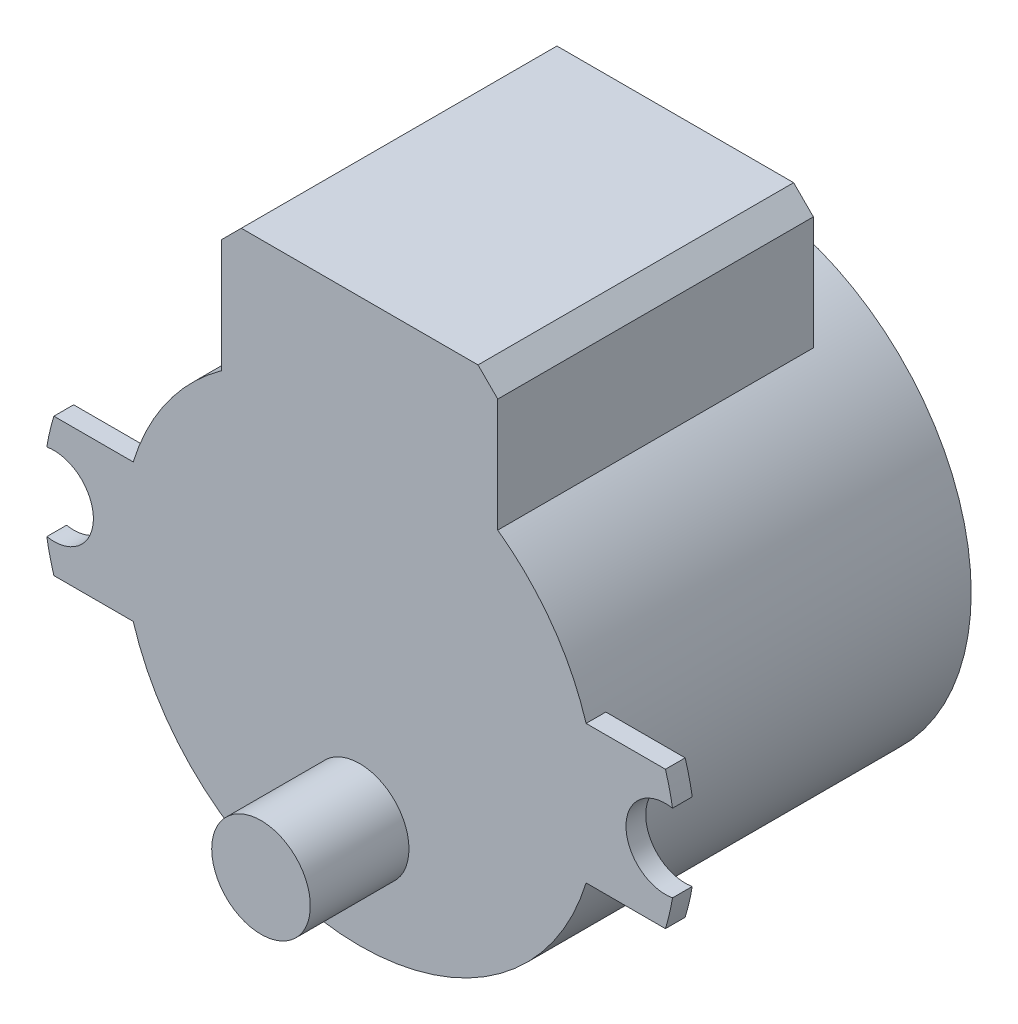
ISO-10303-21;
HEADER;
FILE_DESCRIPTION(('STEP AP214'),'2;1');
FILE_NAME('part.step','',(''),(''),'','','');
FILE_SCHEMA(('AUTOMOTIVE_DESIGN { 1 0 10303 214 1 1 1 1 }'));
ENDSEC;
DATA;
#1=APPLICATION_CONTEXT('core data for automotive mechanical design processes');
#2=APPLICATION_PROTOCOL_DEFINITION('international standard','automotive_design',2000,#1);
#3=PRODUCT_CONTEXT('',#1,'mechanical');
#4=PRODUCT('Part','Part','',(#3));
#5=PRODUCT_RELATED_PRODUCT_CATEGORY('part','',(#4));
#6=PRODUCT_DEFINITION_FORMATION('','',#4);
#7=PRODUCT_DEFINITION_CONTEXT('part definition',#1,'design');
#8=PRODUCT_DEFINITION('design','',#6,#7);
#9=PRODUCT_DEFINITION_SHAPE('','',#8);
#10=(LENGTH_UNIT() NAMED_UNIT(*) SI_UNIT(.MILLI.,.METRE.));
#11=(NAMED_UNIT(*) PLANE_ANGLE_UNIT() SI_UNIT($,.RADIAN.));
#12=(NAMED_UNIT(*) SI_UNIT($,.STERADIAN.) SOLID_ANGLE_UNIT());
#13=UNCERTAINTY_MEASURE_WITH_UNIT(LENGTH_MEASURE(1.E-05),#10,'distance_accuracy_value','');
#14=(GEOMETRIC_REPRESENTATION_CONTEXT(3) GLOBAL_UNCERTAINTY_ASSIGNED_CONTEXT((#13)) GLOBAL_UNIT_ASSIGNED_CONTEXT((#10,
#11,#12)) REPRESENTATION_CONTEXT('',''));
#15=CARTESIAN_POINT('',(0.,0.,0.));
#16=DIRECTION('',(0.,0.,1.));
#17=DIRECTION('',(1.,0.,0.));
#18=AXIS2_PLACEMENT_3D('',#15,#16,#17);
#19=CARTESIAN_POINT('',(-4.021759716751,0.,1.));
#20=DIRECTION('',(0.,0.,-1.));
#21=DIRECTION('',(-1.,0.,0.));
#22=AXIS2_PLACEMENT_3D('',#19,#20,#21);
#23=CYLINDRICAL_SURFACE('',#22,12.);
#24=DIRECTION('',(0.,0.,1.));
#25=VECTOR('',#24,1.);
#26=CARTESIAN_POINT('',(-15.8593756445419,1.96744736806604,-8.5));
#27=LINE('',#26,#25);
#28=CARTESIAN_POINT('',(-15.8593756445419,1.96744736806605,1.));
#29=VERTEX_POINT('',#28);
#30=CARTESIAN_POINT('',(-15.8593756445419,1.96744736806604,0.));
#31=VERTEX_POINT('',#30);
#32=EDGE_CURVE('E165',#29,#31,#27,.F.);
#33=ORIENTED_EDGE('',*,*,#32,.F.);
#34=CARTESIAN_POINT('',(-4.021759716751,0.,1.));
#35=DIRECTION('',(0.,0.,-1.));
#36=DIRECTION('',(-1.,0.,0.));
#37=AXIS2_PLACEMENT_3D('',#34,#35,#36);
#38=CIRCLE('',#37,12.);
#39=CARTESIAN_POINT('',(-15.5,3.5,1.));
#40=VERTEX_POINT('',#39);
#41=EDGE_CURVE('E177',#29,#40,#38,.T.);
#42=ORIENTED_EDGE('',*,*,#41,.T.);
#43=DIRECTION('',(0.,0.,-1.));
#44=VECTOR('',#43,1.);
#45=CARTESIAN_POINT('',(-15.5,3.5,1.));
#46=LINE('',#45,#44);
#47=CARTESIAN_POINT('',(-15.5,3.5,0.));
#48=VERTEX_POINT('',#47);
#49=EDGE_CURVE('E198',#40,#48,#46,.T.);
#50=ORIENTED_EDGE('',*,*,#49,.T.);
#51=CARTESIAN_POINT('',(-4.021759716751,0.,0.));
#52=DIRECTION('',(0.,0.,1.));
#53=DIRECTION('',(1.,0.,0.));
#54=AXIS2_PLACEMENT_3D('',#51,#52,#53);
#55=CIRCLE('',#54,12.);
#56=EDGE_CURVE('E180',#48,#31,#55,.T.);
#57=ORIENTED_EDGE('',*,*,#56,.T.);
#58=EDGE_LOOP('',(#33,#42,#50,#57));
#59=FACE_BOUND('',#58,.T.);
#60=ADVANCED_FACE('F35',(#59),#23,.T.);
#61=CARTESIAN_POINT('',(4.021759716751,0.,1.));
#62=DIRECTION('',(0.,0.,-1.));
#63=DIRECTION('',(-1.,0.,0.));
#64=AXIS2_PLACEMENT_3D('',#61,#62,#63);
#65=CYLINDRICAL_SURFACE('',#64,12.);
#66=DIRECTION('',(0.,0.,1.));
#67=VECTOR('',#66,1.);
#68=CARTESIAN_POINT('',(15.8593756445419,-1.96744736806604,-8.5));
#69=LINE('',#68,#67);
#70=CARTESIAN_POINT('',(15.8593756445419,-1.96744736806605,1.));
#71=VERTEX_POINT('',#70);
#72=CARTESIAN_POINT('',(15.8593756445419,-1.96744736806604,0.));
#73=VERTEX_POINT('',#72);
#74=EDGE_CURVE('E173',#71,#73,#69,.F.);
#75=ORIENTED_EDGE('',*,*,#74,.F.);
#76=CARTESIAN_POINT('',(4.021759716751,0.,1.));
#77=DIRECTION('',(0.,0.,-1.));
#78=DIRECTION('',(-1.,0.,0.));
#79=AXIS2_PLACEMENT_3D('',#76,#77,#78);
#80=CIRCLE('',#79,12.);
#81=CARTESIAN_POINT('',(15.5,-3.5,1.));
#82=VERTEX_POINT('',#81);
#83=EDGE_CURVE('E238',#71,#82,#80,.T.);
#84=ORIENTED_EDGE('',*,*,#83,.T.);
#85=DIRECTION('',(0.,0.,-1.));
#86=VECTOR('',#85,1.);
#87=CARTESIAN_POINT('',(15.5,-3.5,1.));
#88=LINE('',#87,#86);
#89=CARTESIAN_POINT('',(15.5,-3.5,0.));
#90=VERTEX_POINT('',#89);
#91=EDGE_CURVE('E226',#82,#90,#88,.T.);
#92=ORIENTED_EDGE('',*,*,#91,.T.);
#93=CARTESIAN_POINT('',(4.021759716751,0.,0.));
#94=DIRECTION('',(0.,0.,1.));
#95=DIRECTION('',(1.,0.,0.));
#96=AXIS2_PLACEMENT_3D('',#93,#94,#95);
#97=CIRCLE('',#96,12.);
#98=EDGE_CURVE('E221',#90,#73,#97,.T.);
#99=ORIENTED_EDGE('',*,*,#98,.T.);
#100=EDGE_LOOP('',(#75,#84,#92,#99));
#101=FACE_BOUND('',#100,.T.);
#102=ADVANCED_FACE('F322',(#101),#65,.T.);
#103=CARTESIAN_POINT('',(0.,0.,1.));
#104=DIRECTION('',(0.,0.,-1.));
#105=DIRECTION('',(-1.,0.,0.));
#106=AXIS2_PLACEMENT_3D('',#103,#104,#105);
#107=CYLINDRICAL_SURFACE('',#106,12.);
#108=DIRECTION('',(0.,0.,-1.));
#109=VECTOR('',#108,1.);
#110=CARTESIAN_POINT('',(-11.478240283249,3.5,1.));
#111=LINE('',#110,#109);
#112=CARTESIAN_POINT('',(-11.478240283249,3.5,1.));
#113=VERTEX_POINT('',#112);
#114=CARTESIAN_POINT('',(-11.478240283249,3.5,0.));
#115=VERTEX_POINT('',#114);
#116=EDGE_CURVE('E205',#113,#115,#111,.T.);
#117=ORIENTED_EDGE('',*,*,#116,.F.);
#118=CARTESIAN_POINT('',(0.,0.,1.));
#119=DIRECTION('',(0.,0.,-1.));
#120=DIRECTION('',(-1.,0.,0.));
#121=AXIS2_PLACEMENT_3D('',#118,#119,#120);
#122=CIRCLE('',#121,12.);
#123=CARTESIAN_POINT('',(-7.,9.74679434480896,1.));
#124=VERTEX_POINT('',#123);
#125=EDGE_CURVE('E271',#113,#124,#122,.T.);
#126=ORIENTED_EDGE('',*,*,#125,.T.);
#127=DIRECTION('',(0.,0.,-1.));
#128=VECTOR('',#127,1.);
#129=CARTESIAN_POINT('',(-7.,9.74679434480896,1.));
#130=LINE('',#129,#128);
#131=CARTESIAN_POINT('',(-7.,9.74679434480896,-15.));
#132=VERTEX_POINT('',#131);
#133=EDGE_CURVE('E258',#124,#132,#130,.T.);
#134=ORIENTED_EDGE('',*,*,#133,.T.);
#135=CARTESIAN_POINT('',(0.,0.,-15.));
#136=DIRECTION('',(0.,0.,-1.));
#137=DIRECTION('',(-1.,0.,0.));
#138=AXIS2_PLACEMENT_3D('',#135,#136,#137);
#139=CIRCLE('',#138,12.);
#140=CARTESIAN_POINT('',(7.,9.74679434480896,-15.));
#141=VERTEX_POINT('',#140);
#142=EDGE_CURVE('E215',#132,#141,#139,.T.);
#143=ORIENTED_EDGE('',*,*,#142,.T.);
#144=DIRECTION('',(0.,0.,-1.));
#145=VECTOR('',#144,1.);
#146=CARTESIAN_POINT('',(7.,9.74679434480896,1.));
#147=LINE('',#146,#145);
#148=CARTESIAN_POINT('',(7.,9.74679434480896,1.));
#149=VERTEX_POINT('',#148);
#150=EDGE_CURVE('E265',#141,#149,#147,.F.);
#151=ORIENTED_EDGE('',*,*,#150,.T.);
#152=CARTESIAN_POINT('',(11.478240283249,3.5,1.));
#153=VERTEX_POINT('',#152);
#154=EDGE_CURVE('E272',#149,#153,#122,.T.);
#155=ORIENTED_EDGE('',*,*,#154,.T.);
#156=DIRECTION('',(0.,0.,-1.));
#157=VECTOR('',#156,1.);
#158=CARTESIAN_POINT('',(11.478240283249,3.5,1.));
#159=LINE('',#158,#157);
#160=CARTESIAN_POINT('',(11.478240283249,3.5,0.));
#161=VERTEX_POINT('',#160);
#162=EDGE_CURVE('E213',#153,#161,#159,.T.);
#163=ORIENTED_EDGE('',*,*,#162,.T.);
#164=CARTESIAN_POINT('',(0.,0.,0.));
#165=DIRECTION('',(0.,0.,1.));
#166=DIRECTION('',(1.,0.,0.));
#167=AXIS2_PLACEMENT_3D('',#164,#165,#166);
#168=CIRCLE('',#167,12.);
#169=CARTESIAN_POINT('',(11.478240283249,-3.50000000000001,0.));
#170=VERTEX_POINT('',#169);
#171=EDGE_CURVE('E217',#170,#161,#168,.T.);
#172=ORIENTED_EDGE('',*,*,#171,.F.);
#173=DIRECTION('',(0.,0.,-1.));
#174=VECTOR('',#173,1.);
#175=CARTESIAN_POINT('',(11.478240283249,-3.5,1.));
#176=LINE('',#175,#174);
#177=CARTESIAN_POINT('',(11.478240283249,-3.5,1.));
#178=VERTEX_POINT('',#177);
#179=EDGE_CURVE('E222',#178,#170,#176,.T.);
#180=ORIENTED_EDGE('',*,*,#179,.F.);
#181=CARTESIAN_POINT('',(-11.478240283249,-3.5,1.));
#182=VERTEX_POINT('',#181);
#183=EDGE_CURVE('E275',#178,#182,#122,.T.);
#184=ORIENTED_EDGE('',*,*,#183,.T.);
#185=DIRECTION('',(0.,0.,-1.));
#186=VECTOR('',#185,1.);
#187=CARTESIAN_POINT('',(-11.478240283249,-3.5,1.));
#188=LINE('',#187,#186);
#189=CARTESIAN_POINT('',(-11.478240283249,-3.5,0.));
#190=VERTEX_POINT('',#189);
#191=EDGE_CURVE('E375',#182,#190,#188,.T.);
#192=ORIENTED_EDGE('',*,*,#191,.T.);
#193=CARTESIAN_POINT('',(0.,0.,0.));
#194=DIRECTION('',(0.,0.,1.));
#195=DIRECTION('',(1.,0.,0.));
#196=AXIS2_PLACEMENT_3D('',#193,#194,#195);
#197=CIRCLE('',#196,12.);
#198=EDGE_CURVE('E210',#115,#190,#197,.T.);
#199=ORIENTED_EDGE('',*,*,#198,.F.);
#200=EDGE_LOOP('',(#117,#126,#134,#143,#151,#155,#163,#172,#180,#184,#192,#199));
#201=FACE_BOUND('',#200,.T.);
#202=CARTESIAN_POINT('',(0.,0.,-18.));
#203=DIRECTION('',(0.,0.,-1.));
#204=DIRECTION('',(-1.,0.,0.));
#205=AXIS2_PLACEMENT_3D('',#202,#203,#204);
#206=CIRCLE('',#205,12.);
#207=CARTESIAN_POINT('',(-12.,0.,-18.));
#208=VERTEX_POINT('',#207);
#209=EDGE_CURVE('E254',#208,#208,#206,.T.);
#210=ORIENTED_EDGE('',*,*,#209,.F.);
#211=EDGE_LOOP('',(#210));
#212=FACE_BOUND('',#211,.T.);
#213=ADVANCED_FACE('F307',(#201,#212),#107,.T.);
#214=CARTESIAN_POINT('',(12.,0.,1.));
#215=DIRECTION('',(0.,0.,1.));
#216=DIRECTION('',(1.,0.,0.));
#217=AXIS2_PLACEMENT_3D('',#214,#215,#216);
#218=PLANE('',#217);
#219=DIRECTION('',(0.,1.,0.));
#220=VECTOR('',#219,1.);
#221=CARTESIAN_POINT('',(7.,-12.002,1.));
#222=LINE('',#221,#220);
#223=CARTESIAN_POINT('',(7.,15.5,1.));
#224=VERTEX_POINT('',#223);
#225=EDGE_CURVE('E257',#149,#224,#222,.T.);
#226=ORIENTED_EDGE('',*,*,#225,.T.);
#227=DIRECTION('',(0.707106781186547,-0.707106781186548,0.));
#228=VECTOR('',#227,1.);
#229=CARTESIAN_POINT('',(17.25,5.24999999999999,1.));
#230=LINE('',#229,#228);
#231=CARTESIAN_POINT('',(6.,16.5,1.));
#232=VERTEX_POINT('',#231);
#233=EDGE_CURVE('E44',#224,#232,#230,.F.);
#234=ORIENTED_EDGE('',*,*,#233,.T.);
#235=DIRECTION('',(1.,0.,0.));
#236=VECTOR('',#235,1.);
#237=CARTESIAN_POINT('',(-7.,16.5,1.));
#238=LINE('',#237,#236);
#239=CARTESIAN_POINT('',(-6.,16.5,1.));
#240=VERTEX_POINT('',#239);
#241=EDGE_CURVE('E250',#240,#232,#238,.T.);
#242=ORIENTED_EDGE('',*,*,#241,.F.);
#243=DIRECTION('',(0.707106781186548,0.707106781186548,0.));
#244=VECTOR('',#243,1.);
#245=CARTESIAN_POINT('',(-5.25,17.25,1.));
#246=LINE('',#245,#244);
#247=CARTESIAN_POINT('',(-7.,15.5,1.));
#248=VERTEX_POINT('',#247);
#249=EDGE_CURVE('E51',#240,#248,#246,.F.);
#250=ORIENTED_EDGE('',*,*,#249,.T.);
#251=DIRECTION('',(0.,1.,0.));
#252=VECTOR('',#251,1.);
#253=CARTESIAN_POINT('',(-7.,-12.002,1.));
#254=LINE('',#253,#252);
#255=EDGE_CURVE('E255',#124,#248,#254,.T.);
#256=ORIENTED_EDGE('',*,*,#255,.F.);
#257=ORIENTED_EDGE('',*,*,#125,.F.);
#258=DIRECTION('',(-1.,0.,0.));
#259=VECTOR('',#258,1.);
#260=CARTESIAN_POINT('',(-11.478240283249,3.5,1.));
#261=LINE('',#260,#259);
#262=EDGE_CURVE('E187',#113,#40,#261,.T.);
#263=ORIENTED_EDGE('',*,*,#262,.T.);
#264=ORIENTED_EDGE('',*,*,#41,.F.);
#265=CARTESIAN_POINT('',(-15.5,0.,1.));
#266=DIRECTION('',(0.,0.,1.));
#267=DIRECTION('',(1.,0.,0.));
#268=AXIS2_PLACEMENT_3D('',#265,#266,#267);
#269=CIRCLE('',#268,1.99999999999999);
#270=CARTESIAN_POINT('',(-15.8593756445419,-1.96744736806604,1.));
#271=VERTEX_POINT('',#270);
#272=EDGE_CURVE('E162',#271,#29,#269,.T.);
#273=ORIENTED_EDGE('',*,*,#272,.F.);
#274=CARTESIAN_POINT('',(-15.5,-3.5,1.));
#275=VERTEX_POINT('',#274);
#276=EDGE_CURVE('E189',#275,#271,#38,.T.);
#277=ORIENTED_EDGE('',*,*,#276,.F.);
#278=DIRECTION('',(-1.,0.,0.));
#279=VECTOR('',#278,1.);
#280=CARTESIAN_POINT('',(-11.478240283249,-3.5,1.));
#281=LINE('',#280,#279);
#282=EDGE_CURVE('E192',#182,#275,#281,.T.);
#283=ORIENTED_EDGE('',*,*,#282,.F.);
#284=ORIENTED_EDGE('',*,*,#183,.F.);
#285=DIRECTION('',(1.,0.,0.));
#286=VECTOR('',#285,1.);
#287=CARTESIAN_POINT('',(11.478240283249,-3.5,1.));
#288=LINE('',#287,#286);
#289=EDGE_CURVE('E233',#178,#82,#288,.T.);
#290=ORIENTED_EDGE('',*,*,#289,.T.);
#291=ORIENTED_EDGE('',*,*,#83,.F.);
#292=CARTESIAN_POINT('',(15.5,0.,1.));
#293=DIRECTION('',(0.,0.,1.));
#294=DIRECTION('',(1.,0.,0.));
#295=AXIS2_PLACEMENT_3D('',#292,#293,#294);
#296=CIRCLE('',#295,1.99999999999999);
#297=CARTESIAN_POINT('',(15.8593756445419,1.96744736806605,1.));
#298=VERTEX_POINT('',#297);
#299=EDGE_CURVE('E181',#298,#71,#296,.T.);
#300=ORIENTED_EDGE('',*,*,#299,.F.);
#301=CARTESIAN_POINT('',(15.5,3.5,1.));
#302=VERTEX_POINT('',#301);
#303=EDGE_CURVE('E234',#302,#298,#80,.T.);
#304=ORIENTED_EDGE('',*,*,#303,.F.);
#305=DIRECTION('',(1.,0.,0.));
#306=VECTOR('',#305,1.);
#307=CARTESIAN_POINT('',(11.478240283249,3.5,1.));
#308=LINE('',#307,#306);
#309=EDGE_CURVE('E237',#153,#302,#308,.T.);
#310=ORIENTED_EDGE('',*,*,#309,.F.);
#311=ORIENTED_EDGE('',*,*,#154,.F.);
#312=EDGE_LOOP('',(#226,#234,#242,#250,#256,#257,#263,#264,#273,#277,#283,#284,#290,#291,#300,
#304,#310,#311));
#313=FACE_BOUND('',#312,.T.);
#314=CARTESIAN_POINT('',(0.,-6.5,1.));
#315=DIRECTION('',(0.,0.,1.));
#316=DIRECTION('',(1.,0.,0.));
#317=AXIS2_PLACEMENT_3D('',#314,#315,#316);
#318=CIRCLE('',#317,2.5);
#319=CARTESIAN_POINT('',(2.5,-6.5,1.));
#320=VERTEX_POINT('',#319);
#321=EDGE_CURVE('E274',#320,#320,#318,.T.);
#322=ORIENTED_EDGE('',*,*,#321,.F.);
#323=EDGE_LOOP('',(#322));
#324=FACE_BOUND('',#323,.T.);
#325=ADVANCED_FACE('F184',(#313,#324),#218,.T.);
#326=CARTESIAN_POINT('',(0.,0.,-18.));
#327=DIRECTION('',(0.,0.,-1.));
#328=DIRECTION('',(-1.,0.,0.));
#329=AXIS2_PLACEMENT_3D('',#326,#327,#328);
#330=PLANE('',#329);
#331=ORIENTED_EDGE('',*,*,#209,.T.);
#332=EDGE_LOOP('',(#331));
#333=FACE_BOUND('',#332,.T.);
#334=ADVANCED_FACE('F430',(#333),#330,.T.);
#335=CARTESIAN_POINT('',(7.,-12.002,1.));
#336=DIRECTION('',(1.,0.,0.));
#337=DIRECTION('',(0.,0.,-1.));
#338=AXIS2_PLACEMENT_3D('',#335,#336,#337);
#339=PLANE('',#338);
#340=DIRECTION('',(0.,1.,0.));
#341=VECTOR('',#340,1.);
#342=CARTESIAN_POINT('',(7.,-12.002,-15.));
#343=LINE('',#342,#341);
#344=CARTESIAN_POINT('',(7.,15.5,-15.));
#345=VERTEX_POINT('',#344);
#346=EDGE_CURVE('E260',#141,#345,#343,.T.);
#347=ORIENTED_EDGE('',*,*,#346,.T.);
#348=DIRECTION('',(0.,0.,1.));
#349=VECTOR('',#348,1.);
#350=CARTESIAN_POINT('',(7.,15.5,1.));
#351=LINE('',#350,#349);
#352=EDGE_CURVE('E59',#345,#224,#351,.T.);
#353=ORIENTED_EDGE('',*,*,#352,.T.);
#354=ORIENTED_EDGE('',*,*,#225,.F.);
#355=ORIENTED_EDGE('',*,*,#150,.F.);
#356=EDGE_LOOP('',(#347,#353,#354,#355));
#357=FACE_BOUND('',#356,.T.);
#358=ADVANCED_FACE('F304',(#357),#339,.T.);
#359=CARTESIAN_POINT('',(0.,16.5,0.));
#360=DIRECTION('',(0.,1.,0.));
#361=DIRECTION('',(0.,0.,1.));
#362=AXIS2_PLACEMENT_3D('',#359,#360,#361);
#363=PLANE('',#362);
#364=ORIENTED_EDGE('',*,*,#241,.T.);
#365=DIRECTION('',(0.,0.,-1.));
#366=VECTOR('',#365,1.);
#367=CARTESIAN_POINT('',(6.,16.5,0.));
#368=LINE('',#367,#366);
#369=CARTESIAN_POINT('',(6.,16.5,-15.));
#370=VERTEX_POINT('',#369);
#371=EDGE_CURVE('E283',#232,#370,#368,.T.);
#372=ORIENTED_EDGE('',*,*,#371,.T.);
#373=DIRECTION('',(-1.,0.,0.));
#374=VECTOR('',#373,1.);
#375=CARTESIAN_POINT('',(7.,16.5,-15.));
#376=LINE('',#375,#374);
#377=CARTESIAN_POINT('',(-6.,16.5,-15.));
#378=VERTEX_POINT('',#377);
#379=EDGE_CURVE('E247',#370,#378,#376,.T.);
#380=ORIENTED_EDGE('',*,*,#379,.T.);
#381=DIRECTION('',(0.,0.,1.));
#382=VECTOR('',#381,1.);
#383=CARTESIAN_POINT('',(-6.,16.5,0.));
#384=LINE('',#383,#382);
#385=EDGE_CURVE('E172',#378,#240,#384,.T.);
#386=ORIENTED_EDGE('',*,*,#385,.T.);
#387=EDGE_LOOP('',(#364,#372,#380,#386));
#388=FACE_BOUND('',#387,.T.);
#389=ADVANCED_FACE('F295',(#388),#363,.T.);
#390=CARTESIAN_POINT('',(-7.,-12.002,-15.));
#391=DIRECTION('',(-1.,0.,0.));
#392=DIRECTION('',(0.,0.,1.));
#393=AXIS2_PLACEMENT_3D('',#390,#391,#392);
#394=PLANE('',#393);
#395=ORIENTED_EDGE('',*,*,#255,.T.);
#396=DIRECTION('',(0.,0.,-1.));
#397=VECTOR('',#396,1.);
#398=CARTESIAN_POINT('',(-7.,15.5,-15.));
#399=LINE('',#398,#397);
#400=CARTESIAN_POINT('',(-7.,15.5,-15.));
#401=VERTEX_POINT('',#400);
#402=EDGE_CURVE('E11',#248,#401,#399,.T.);
#403=ORIENTED_EDGE('',*,*,#402,.T.);
#404=DIRECTION('',(0.,1.,0.));
#405=VECTOR('',#404,1.);
#406=CARTESIAN_POINT('',(-7.,-12.002,-15.));
#407=LINE('',#406,#405);
#408=EDGE_CURVE('E251',#132,#401,#407,.T.);
#409=ORIENTED_EDGE('',*,*,#408,.F.);
#410=ORIENTED_EDGE('',*,*,#133,.F.);
#411=EDGE_LOOP('',(#395,#403,#409,#410));
#412=FACE_BOUND('',#411,.T.);
#413=ADVANCED_FACE('F314',(#412),#394,.T.);
#414=CARTESIAN_POINT('',(7.,-12.002,-15.));
#415=DIRECTION('',(0.,0.,-1.));
#416=DIRECTION('',(-1.,0.,0.));
#417=AXIS2_PLACEMENT_3D('',#414,#415,#416);
#418=PLANE('',#417);
#419=ORIENTED_EDGE('',*,*,#379,.F.);
#420=DIRECTION('',(-0.707106781186547,0.707106781186548,0.));
#421=VECTOR('',#420,1.);
#422=CARTESIAN_POINT('',(20.751,1.74899999999999,-15.));
#423=LINE('',#422,#421);
#424=EDGE_CURVE('E288',#370,#345,#423,.F.);
#425=ORIENTED_EDGE('',*,*,#424,.T.);
#426=ORIENTED_EDGE('',*,*,#346,.F.);
#427=ORIENTED_EDGE('',*,*,#142,.F.);
#428=ORIENTED_EDGE('',*,*,#408,.T.);
#429=DIRECTION('',(-0.707106781186548,-0.707106781186548,0.));
#430=VECTOR('',#429,1.);
#431=CARTESIAN_POINT('',(-13.751,8.749,-15.));
#432=LINE('',#431,#430);
#433=EDGE_CURVE('E286',#401,#378,#432,.F.);
#434=ORIENTED_EDGE('',*,*,#433,.T.);
#435=EDGE_LOOP('',(#419,#425,#426,#427,#428,#434));
#436=FACE_BOUND('',#435,.T.);
#437=ADVANCED_FACE('F301',(#436),#418,.T.);
#438=DIRECTION('',(0.,0.,1.));
#439=VECTOR('',#438,1.);
#440=CARTESIAN_POINT('',(15.8593756445419,1.96744736806604,-8.5));
#441=LINE('',#440,#439);
#442=CARTESIAN_POINT('',(15.8593756445419,1.96744736806604,0.));
#443=VERTEX_POINT('',#442);
#444=EDGE_CURVE('E278',#443,#298,#441,.T.);
#445=ORIENTED_EDGE('',*,*,#444,.F.);
#446=CARTESIAN_POINT('',(15.5,3.5,0.));
#447=VERTEX_POINT('',#446);
#448=EDGE_CURVE('E231',#443,#447,#97,.T.);
#449=ORIENTED_EDGE('',*,*,#448,.T.);
#450=DIRECTION('',(0.,0.,-1.));
#451=VECTOR('',#450,1.);
#452=CARTESIAN_POINT('',(15.5,3.5,1.));
#453=LINE('',#452,#451);
#454=EDGE_CURVE('E216',#302,#447,#453,.T.);
#455=ORIENTED_EDGE('',*,*,#454,.F.);
#456=ORIENTED_EDGE('',*,*,#303,.T.);
#457=EDGE_LOOP('',(#445,#449,#455,#456));
#458=FACE_BOUND('',#457,.T.);
#459=ADVANCED_FACE('F330',(#458),#65,.T.);
#460=CARTESIAN_POINT('',(11.478240283249,-3.5,1.));
#461=DIRECTION('',(0.,-1.,0.));
#462=DIRECTION('',(0.,0.,-1.));
#463=AXIS2_PLACEMENT_3D('',#460,#461,#462);
#464=PLANE('',#463);
#465=ORIENTED_EDGE('',*,*,#91,.F.);
#466=ORIENTED_EDGE('',*,*,#289,.F.);
#467=ORIENTED_EDGE('',*,*,#179,.T.);
#468=DIRECTION('',(1.,0.,0.));
#469=VECTOR('',#468,1.);
#470=CARTESIAN_POINT('',(11.478240283249,-3.50000000000001,0.));
#471=LINE('',#470,#469);
#472=EDGE_CURVE('E225',#170,#90,#471,.T.);
#473=ORIENTED_EDGE('',*,*,#472,.T.);
#474=EDGE_LOOP('',(#465,#466,#467,#473));
#475=FACE_BOUND('',#474,.T.);
#476=ADVANCED_FACE('F391',(#475),#464,.T.);
#477=CARTESIAN_POINT('',(11.478240283249,3.5,0.));
#478=DIRECTION('',(0.,0.,-1.));
#479=DIRECTION('',(-1.,0.,0.));
#480=AXIS2_PLACEMENT_3D('',#477,#478,#479);
#481=PLANE('',#480);
#482=CARTESIAN_POINT('',(15.5,0.,0.));
#483=DIRECTION('',(0.,0.,-1.));
#484=DIRECTION('',(-1.,0.,0.));
#485=AXIS2_PLACEMENT_3D('',#482,#483,#484);
#486=CIRCLE('',#485,1.99999999999999);
#487=EDGE_CURVE('E194',#73,#443,#486,.T.);
#488=ORIENTED_EDGE('',*,*,#487,.F.);
#489=ORIENTED_EDGE('',*,*,#98,.F.);
#490=ORIENTED_EDGE('',*,*,#472,.F.);
#491=ORIENTED_EDGE('',*,*,#171,.T.);
#492=DIRECTION('',(1.,0.,0.));
#493=VECTOR('',#492,1.);
#494=CARTESIAN_POINT('',(11.478240283249,3.5,0.));
#495=LINE('',#494,#493);
#496=EDGE_CURVE('E220',#161,#447,#495,.T.);
#497=ORIENTED_EDGE('',*,*,#496,.T.);
#498=ORIENTED_EDGE('',*,*,#448,.F.);
#499=EDGE_LOOP('',(#488,#489,#490,#491,#497,#498));
#500=FACE_BOUND('',#499,.T.);
#501=ADVANCED_FACE('F345',(#500),#481,.T.);
#502=CARTESIAN_POINT('',(11.478240283249,3.5,1.));
#503=DIRECTION('',(0.,-1.,0.));
#504=DIRECTION('',(0.,0.,-1.));
#505=AXIS2_PLACEMENT_3D('',#502,#503,#504);
#506=PLANE('',#505);
#507=ORIENTED_EDGE('',*,*,#454,.T.);
#508=ORIENTED_EDGE('',*,*,#496,.F.);
#509=ORIENTED_EDGE('',*,*,#162,.F.);
#510=ORIENTED_EDGE('',*,*,#309,.T.);
#511=EDGE_LOOP('',(#507,#508,#509,#510));
#512=FACE_BOUND('',#511,.T.);
#513=ADVANCED_FACE('F335',(#512),#506,.F.);
#514=DIRECTION('',(0.,0.,1.));
#515=VECTOR('',#514,1.);
#516=CARTESIAN_POINT('',(-15.8593756445419,-1.96744736806604,-8.5));
#517=LINE('',#516,#515);
#518=CARTESIAN_POINT('',(-15.8593756445419,-1.96744736806605,0.));
#519=VERTEX_POINT('',#518);
#520=EDGE_CURVE('E168',#519,#271,#517,.T.);
#521=ORIENTED_EDGE('',*,*,#520,.F.);
#522=CARTESIAN_POINT('',(-15.5,-3.5,0.));
#523=VERTEX_POINT('',#522);
#524=EDGE_CURVE('E204',#519,#523,#55,.T.);
#525=ORIENTED_EDGE('',*,*,#524,.T.);
#526=DIRECTION('',(0.,0.,-1.));
#527=VECTOR('',#526,1.);
#528=CARTESIAN_POINT('',(-15.5,-3.5,1.));
#529=LINE('',#528,#527);
#530=EDGE_CURVE('E209',#275,#523,#529,.T.);
#531=ORIENTED_EDGE('',*,*,#530,.F.);
#532=ORIENTED_EDGE('',*,*,#276,.T.);
#533=EDGE_LOOP('',(#521,#525,#531,#532));
#534=FACE_BOUND('',#533,.T.);
#535=ADVANCED_FACE('F324',(#534),#23,.T.);
#536=CARTESIAN_POINT('',(-11.478240283249,3.5,1.));
#537=DIRECTION('',(0.,1.,0.));
#538=DIRECTION('',(0.,0.,1.));
#539=AXIS2_PLACEMENT_3D('',#536,#537,#538);
#540=PLANE('',#539);
#541=ORIENTED_EDGE('',*,*,#49,.F.);
#542=ORIENTED_EDGE('',*,*,#262,.F.);
#543=ORIENTED_EDGE('',*,*,#116,.T.);
#544=DIRECTION('',(-1.,0.,0.));
#545=VECTOR('',#544,1.);
#546=CARTESIAN_POINT('',(-11.478240283249,3.5,0.));
#547=LINE('',#546,#545);
#548=EDGE_CURVE('E201',#115,#48,#547,.T.);
#549=ORIENTED_EDGE('',*,*,#548,.T.);
#550=EDGE_LOOP('',(#541,#542,#543,#549));
#551=FACE_BOUND('',#550,.T.);
#552=ADVANCED_FACE('F334',(#551),#540,.T.);
#553=CARTESIAN_POINT('',(-11.478240283249,-3.5,0.));
#554=DIRECTION('',(0.,0.,-1.));
#555=DIRECTION('',(-1.,0.,0.));
#556=AXIS2_PLACEMENT_3D('',#553,#554,#555);
#557=PLANE('',#556);
#558=CARTESIAN_POINT('',(-15.5,0.,0.));
#559=DIRECTION('',(0.,0.,-1.));
#560=DIRECTION('',(-1.,0.,0.));
#561=AXIS2_PLACEMENT_3D('',#558,#559,#560);
#562=CIRCLE('',#561,1.99999999999999);
#563=EDGE_CURVE('E182',#31,#519,#562,.T.);
#564=ORIENTED_EDGE('',*,*,#563,.F.);
#565=ORIENTED_EDGE('',*,*,#56,.F.);
#566=ORIENTED_EDGE('',*,*,#548,.F.);
#567=ORIENTED_EDGE('',*,*,#198,.T.);
#568=DIRECTION('',(-1.,0.,0.));
#569=VECTOR('',#568,1.);
#570=CARTESIAN_POINT('',(-11.478240283249,-3.5,0.));
#571=LINE('',#570,#569);
#572=EDGE_CURVE('E206',#190,#523,#571,.T.);
#573=ORIENTED_EDGE('',*,*,#572,.T.);
#574=ORIENTED_EDGE('',*,*,#524,.F.);
#575=EDGE_LOOP('',(#564,#565,#566,#567,#573,#574));
#576=FACE_BOUND('',#575,.T.);
#577=ADVANCED_FACE('F342',(#576),#557,.T.);
#578=CARTESIAN_POINT('',(-11.478240283249,-3.5,1.));
#579=DIRECTION('',(0.,1.,0.));
#580=DIRECTION('',(0.,0.,1.));
#581=AXIS2_PLACEMENT_3D('',#578,#579,#580);
#582=PLANE('',#581);
#583=ORIENTED_EDGE('',*,*,#530,.T.);
#584=ORIENTED_EDGE('',*,*,#572,.F.);
#585=ORIENTED_EDGE('',*,*,#191,.F.);
#586=ORIENTED_EDGE('',*,*,#282,.T.);
#587=EDGE_LOOP('',(#583,#584,#585,#586));
#588=FACE_BOUND('',#587,.T.);
#589=ADVANCED_FACE('F350',(#588),#582,.F.);
#590=CARTESIAN_POINT('',(0.,-6.5,6.));
#591=DIRECTION('',(0.,0.,-1.));
#592=DIRECTION('',(-1.,0.,0.));
#593=AXIS2_PLACEMENT_3D('',#590,#591,#592);
#594=CYLINDRICAL_SURFACE('',#593,2.5);
#595=CARTESIAN_POINT('',(0.,-6.5,6.));
#596=DIRECTION('',(0.,0.,-1.));
#597=DIRECTION('',(-1.,0.,0.));
#598=AXIS2_PLACEMENT_3D('',#595,#596,#597);
#599=CIRCLE('',#598,2.5);
#600=CARTESIAN_POINT('',(-2.5,-6.5,6.));
#601=VERTEX_POINT('',#600);
#602=EDGE_CURVE('E190',#601,#601,#599,.T.);
#603=ORIENTED_EDGE('',*,*,#602,.T.);
#604=EDGE_LOOP('',(#603));
#605=FACE_BOUND('',#604,.T.);
#606=ORIENTED_EDGE('',*,*,#321,.T.);
#607=EDGE_LOOP('',(#606));
#608=FACE_BOUND('',#607,.T.);
#609=ADVANCED_FACE('F337',(#605,#608),#594,.T.);
#610=CARTESIAN_POINT('',(2.5,-6.5,6.));
#611=DIRECTION('',(0.,0.,1.));
#612=DIRECTION('',(1.,0.,0.));
#613=AXIS2_PLACEMENT_3D('',#610,#611,#612);
#614=PLANE('',#613);
#615=ORIENTED_EDGE('',*,*,#602,.F.);
#616=EDGE_LOOP('',(#615));
#617=FACE_BOUND('',#616,.T.);
#618=ADVANCED_FACE('F349',(#617),#614,.T.);
#619=CARTESIAN_POINT('',(15.5,0.,1.));
#620=DIRECTION('',(0.,0.,1.));
#621=DIRECTION('',(1.,0.,0.));
#622=AXIS2_PLACEMENT_3D('',#619,#620,#621);
#623=CYLINDRICAL_SURFACE('',#622,1.99999999999999);
#624=ORIENTED_EDGE('',*,*,#74,.T.);
#625=ORIENTED_EDGE('',*,*,#487,.T.);
#626=ORIENTED_EDGE('',*,*,#444,.T.);
#627=ORIENTED_EDGE('',*,*,#299,.T.);
#628=EDGE_LOOP('',(#624,#625,#626,#627));
#629=FACE_BOUND('',#628,.T.);
#630=ADVANCED_FACE('F357',(#629),#623,.F.);
#631=CARTESIAN_POINT('',(-15.5,0.,1.));
#632=DIRECTION('',(0.,0.,1.));
#633=DIRECTION('',(1.,0.,0.));
#634=AXIS2_PLACEMENT_3D('',#631,#632,#633);
#635=CYLINDRICAL_SURFACE('',#634,1.99999999999999);
#636=ORIENTED_EDGE('',*,*,#32,.T.);
#637=ORIENTED_EDGE('',*,*,#563,.T.);
#638=ORIENTED_EDGE('',*,*,#520,.T.);
#639=ORIENTED_EDGE('',*,*,#272,.T.);
#640=EDGE_LOOP('',(#636,#637,#638,#639));
#641=FACE_BOUND('',#640,.T.);
#642=ADVANCED_FACE('F164',(#641),#635,.F.);
#643=CARTESIAN_POINT('',(6.,16.5,0.));
#644=DIRECTION('',(-0.707106781186548,-0.707106781186547,0.));
#645=DIRECTION('',(0.,0.,-1.));
#646=AXIS2_PLACEMENT_3D('',#643,#644,#645);
#647=PLANE('',#646);
#648=ORIENTED_EDGE('',*,*,#233,.F.);
#649=ORIENTED_EDGE('',*,*,#352,.F.);
#650=ORIENTED_EDGE('',*,*,#424,.F.);
#651=ORIENTED_EDGE('',*,*,#371,.F.);
#652=EDGE_LOOP('',(#648,#649,#650,#651));
#653=FACE_BOUND('',#652,.T.);
#654=ADVANCED_FACE('F298',(#653),#647,.F.);
#655=CARTESIAN_POINT('',(-6.,16.5,0.));
#656=DIRECTION('',(0.707106781186547,-0.707106781186547,0.));
#657=DIRECTION('',(0.,0.,1.));
#658=AXIS2_PLACEMENT_3D('',#655,#656,#657);
#659=PLANE('',#658);
#660=ORIENTED_EDGE('',*,*,#433,.F.);
#661=ORIENTED_EDGE('',*,*,#402,.F.);
#662=ORIENTED_EDGE('',*,*,#249,.F.);
#663=ORIENTED_EDGE('',*,*,#385,.F.);
#664=EDGE_LOOP('',(#660,#661,#662,#663));
#665=FACE_BOUND('',#664,.T.);
#666=ADVANCED_FACE('F38',(#665),#659,.F.);
#667=CLOSED_SHELL('',(#60,#102,#213,#325,#334,#358,#389,#413,#437,#459,#476,#501,#513,#535,#552,
#577,#589,#609,#618,#630,#642,#654,#666));
#668=MANIFOLD_SOLID_BREP('B2',#667);
#669=ADVANCED_BREP_SHAPE_REPRESENTATION('',(#18,#668),#14);
#670=SHAPE_DEFINITION_REPRESENTATION(#9,#669);
ENDSEC;
END-ISO-10303-21;
